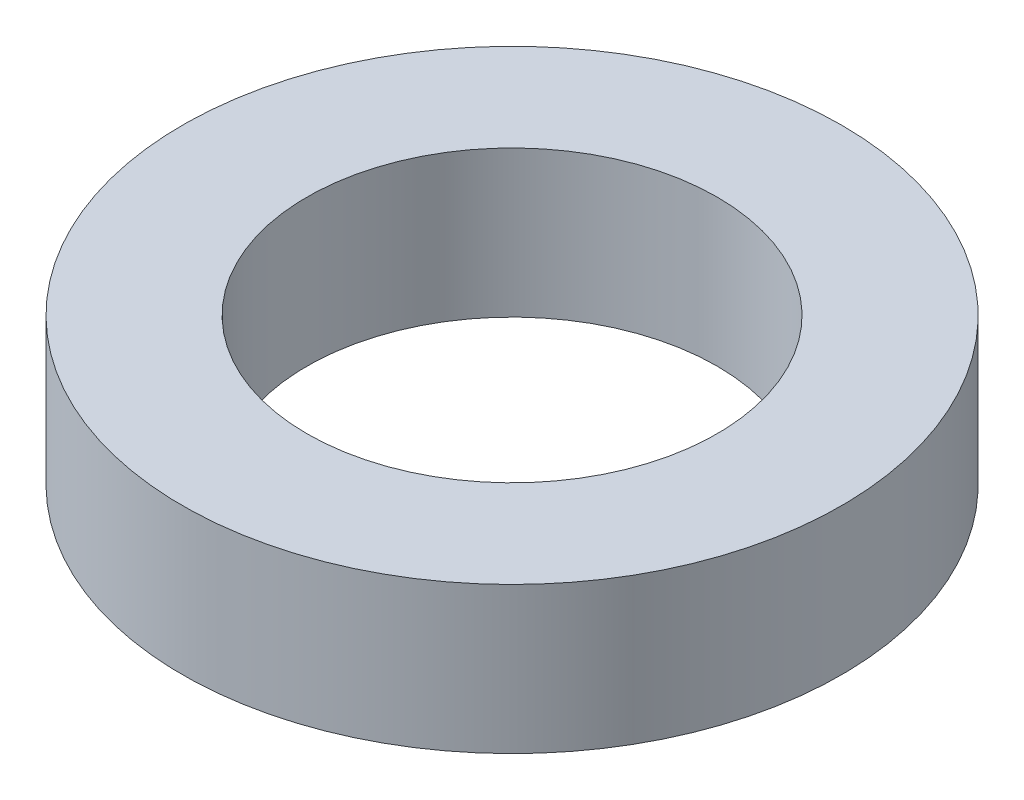
ISO-10303-21;
HEADER;
FILE_DESCRIPTION(('STEP AP214'),'2;1');
FILE_NAME('part.step','',(''),(''),'','','');
FILE_SCHEMA(('AUTOMOTIVE_DESIGN { 1 0 10303 214 1 1 1 1 }'));
ENDSEC;
DATA;
#1=APPLICATION_CONTEXT('core data for automotive mechanical design processes');
#2=APPLICATION_PROTOCOL_DEFINITION('international standard','automotive_design',2000,#1);
#3=PRODUCT_CONTEXT('',#1,'mechanical');
#4=PRODUCT('Part','Part','',(#3));
#5=PRODUCT_RELATED_PRODUCT_CATEGORY('part','',(#4));
#6=PRODUCT_DEFINITION_FORMATION('','',#4);
#7=PRODUCT_DEFINITION_CONTEXT('part definition',#1,'design');
#8=PRODUCT_DEFINITION('design','',#6,#7);
#9=PRODUCT_DEFINITION_SHAPE('','',#8);
#10=(LENGTH_UNIT() NAMED_UNIT(*) SI_UNIT(.MILLI.,.METRE.));
#11=(NAMED_UNIT(*) PLANE_ANGLE_UNIT() SI_UNIT($,.RADIAN.));
#12=(NAMED_UNIT(*) SI_UNIT($,.STERADIAN.) SOLID_ANGLE_UNIT());
#13=UNCERTAINTY_MEASURE_WITH_UNIT(LENGTH_MEASURE(1.E-05),#10,'distance_accuracy_value','');
#14=(GEOMETRIC_REPRESENTATION_CONTEXT(3) GLOBAL_UNCERTAINTY_ASSIGNED_CONTEXT((#13)) GLOBAL_UNIT_ASSIGNED_CONTEXT((#10,
#11,#12)) REPRESENTATION_CONTEXT('',''));
#15=CARTESIAN_POINT('',(0.,0.,0.));
#16=DIRECTION('',(0.,0.,1.));
#17=DIRECTION('',(1.,0.,0.));
#18=AXIS2_PLACEMENT_3D('',#15,#16,#17);
#19=CARTESIAN_POINT('',(0.,0.,0.));
#20=DIRECTION('',(0.,-1.,0.));
#21=DIRECTION('',(0.,0.,-1.));
#22=AXIS2_PLACEMENT_3D('',#19,#20,#21);
#23=PLANE('',#22);
#24=CARTESIAN_POINT('',(0.,0.,0.));
#25=DIRECTION('',(0.,1.,0.));
#26=DIRECTION('',(0.,0.,1.));
#27=AXIS2_PLACEMENT_3D('',#24,#25,#26);
#28=CIRCLE('',#27,2.8);
#29=CARTESIAN_POINT('',(0.,0.,2.8));
#30=VERTEX_POINT('',#29);
#31=EDGE_CURVE('E47',#30,#30,#28,.T.);
#32=ORIENTED_EDGE('',*,*,#31,.T.);
#33=EDGE_LOOP('',(#32));
#34=FACE_BOUND('',#33,.T.);
#35=CARTESIAN_POINT('',(0.,0.,0.));
#36=DIRECTION('',(0.,-1.,0.));
#37=DIRECTION('',(0.,0.,-1.));
#38=AXIS2_PLACEMENT_3D('',#35,#36,#37);
#39=CIRCLE('',#38,4.5);
#40=CARTESIAN_POINT('',(0.,0.,-4.5));
#41=VERTEX_POINT('',#40);
#42=EDGE_CURVE('E10',#41,#41,#39,.T.);
#43=ORIENTED_EDGE('',*,*,#42,.T.);
#44=EDGE_LOOP('',(#43));
#45=FACE_BOUND('',#44,.T.);
#46=ADVANCED_FACE('F37',(#34,#45),#23,.T.);
#47=CARTESIAN_POINT('',(0.,0.,0.));
#48=DIRECTION('',(0.,-1.,0.));
#49=DIRECTION('',(0.,0.,-1.));
#50=AXIS2_PLACEMENT_3D('',#47,#48,#49);
#51=CYLINDRICAL_SURFACE('',#50,4.5);
#52=CARTESIAN_POINT('',(0.,2.,0.));
#53=DIRECTION('',(0.,-1.,0.));
#54=DIRECTION('',(0.,0.,-1.));
#55=AXIS2_PLACEMENT_3D('',#52,#53,#54);
#56=CIRCLE('',#55,4.5);
#57=CARTESIAN_POINT('',(0.,2.,-4.5));
#58=VERTEX_POINT('',#57);
#59=EDGE_CURVE('E43',#58,#58,#56,.T.);
#60=ORIENTED_EDGE('',*,*,#59,.T.);
#61=EDGE_LOOP('',(#60));
#62=FACE_BOUND('',#61,.T.);
#63=ORIENTED_EDGE('',*,*,#42,.F.);
#64=EDGE_LOOP('',(#63));
#65=FACE_BOUND('',#64,.T.);
#66=ADVANCED_FACE('F62',(#62,#65),#51,.T.);
#67=CARTESIAN_POINT('',(4.5,2.,0.));
#68=DIRECTION('',(0.,1.,0.));
#69=DIRECTION('',(0.,0.,1.));
#70=AXIS2_PLACEMENT_3D('',#67,#68,#69);
#71=PLANE('',#70);
#72=CARTESIAN_POINT('',(0.,2.,0.));
#73=DIRECTION('',(0.,1.,0.));
#74=DIRECTION('',(0.,0.,1.));
#75=AXIS2_PLACEMENT_3D('',#72,#73,#74);
#76=CIRCLE('',#75,2.8);
#77=CARTESIAN_POINT('',(0.,2.,2.8));
#78=VERTEX_POINT('',#77);
#79=EDGE_CURVE('E51',#78,#78,#76,.T.);
#80=ORIENTED_EDGE('',*,*,#79,.F.);
#81=EDGE_LOOP('',(#80));
#82=FACE_BOUND('',#81,.T.);
#83=ORIENTED_EDGE('',*,*,#59,.F.);
#84=EDGE_LOOP('',(#83));
#85=FACE_BOUND('',#84,.T.);
#86=ADVANCED_FACE('F59',(#82,#85),#71,.T.);
#87=CARTESIAN_POINT('',(0.,0.,0.));
#88=DIRECTION('',(0.,1.,0.));
#89=DIRECTION('',(0.,0.,1.));
#90=AXIS2_PLACEMENT_3D('',#87,#88,#89);
#91=CYLINDRICAL_SURFACE('',#90,2.8);
#92=ORIENTED_EDGE('',*,*,#31,.F.);
#93=EDGE_LOOP('',(#92));
#94=FACE_BOUND('',#93,.T.);
#95=ORIENTED_EDGE('',*,*,#79,.T.);
#96=EDGE_LOOP('',(#95));
#97=FACE_BOUND('',#96,.T.);
#98=ADVANCED_FACE('F57',(#94,#97),#91,.F.);
#99=CLOSED_SHELL('',(#46,#66,#86,#98));
#100=MANIFOLD_SOLID_BREP('B2',#99);
#101=ADVANCED_BREP_SHAPE_REPRESENTATION('',(#18,#100),#14);
#102=SHAPE_DEFINITION_REPRESENTATION(#9,#101);
ENDSEC;
END-ISO-10303-21;
